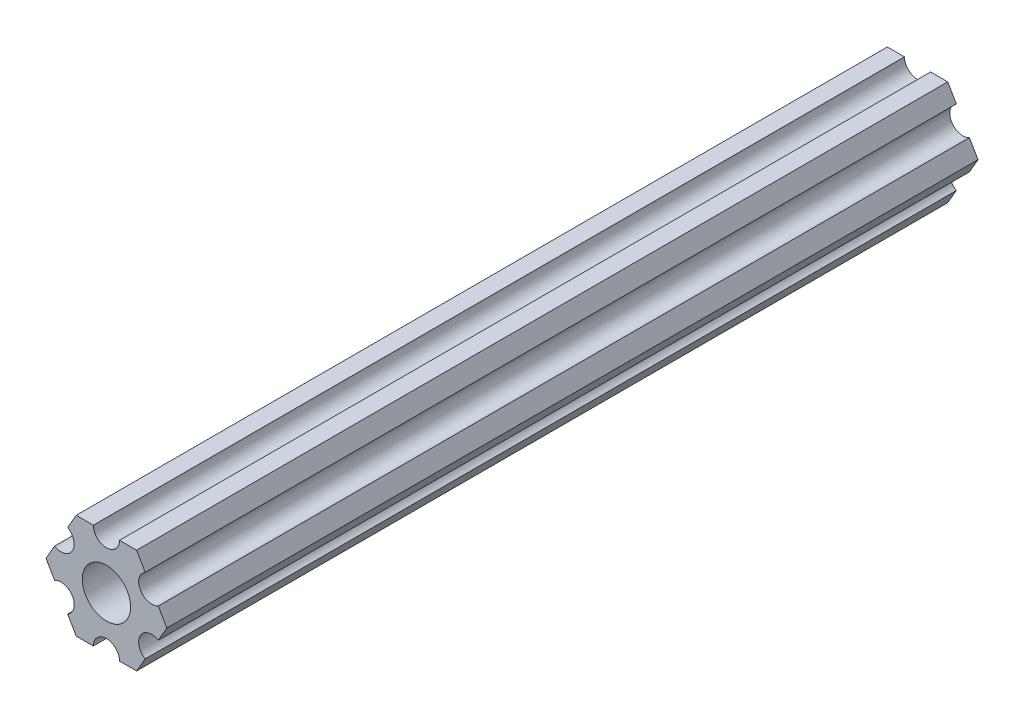
ISO-10303-21;
HEADER;
FILE_DESCRIPTION(('STEP AP214'),'2;1');
FILE_NAME('part.step','',(''),(''),'','','');
FILE_SCHEMA(('AUTOMOTIVE_DESIGN { 1 0 10303 214 1 1 1 1 }'));
ENDSEC;
DATA;
#1=APPLICATION_CONTEXT('core data for automotive mechanical design processes');
#2=APPLICATION_PROTOCOL_DEFINITION('international standard','automotive_design',2000,#1);
#3=PRODUCT_CONTEXT('',#1,'mechanical');
#4=PRODUCT('Part','Part','',(#3));
#5=PRODUCT_RELATED_PRODUCT_CATEGORY('part','',(#4));
#6=PRODUCT_DEFINITION_FORMATION('','',#4);
#7=PRODUCT_DEFINITION_CONTEXT('part definition',#1,'design');
#8=PRODUCT_DEFINITION('design','',#6,#7);
#9=PRODUCT_DEFINITION_SHAPE('','',#8);
#10=(LENGTH_UNIT() NAMED_UNIT(*) SI_UNIT(.MILLI.,.METRE.));
#11=(NAMED_UNIT(*) PLANE_ANGLE_UNIT() SI_UNIT($,.RADIAN.));
#12=(NAMED_UNIT(*) SI_UNIT($,.STERADIAN.) SOLID_ANGLE_UNIT());
#13=UNCERTAINTY_MEASURE_WITH_UNIT(LENGTH_MEASURE(1.E-05),#10,'distance_accuracy_value','');
#14=(GEOMETRIC_REPRESENTATION_CONTEXT(3) GLOBAL_UNCERTAINTY_ASSIGNED_CONTEXT((#13)) GLOBAL_UNIT_ASSIGNED_CONTEXT((#10,
#11,#12)) REPRESENTATION_CONTEXT('',''));
#15=CARTESIAN_POINT('',(0.,0.,0.));
#16=DIRECTION('',(0.,0.,1.));
#17=DIRECTION('',(1.,0.,0.));
#18=AXIS2_PLACEMENT_3D('',#15,#16,#17);
#19=CARTESIAN_POINT('',(6.29301142309098,-1.80018429024546,98.425));
#20=DIRECTION('',(-0.866025434075723,0.499999947533953,0.));
#21=DIRECTION('',(-0.499999947533953,-0.866025434075723,0.));
#22=AXIS2_PLACEMENT_3D('',#19,#20,#21);
#23=PLANE('',#22);
#24=DIRECTION('',(0.,0.,1.));
#25=VECTOR('',#24,1.);
#26=CARTESIAN_POINT('',(7.33234841870826,4.44212519169686E-07,98.425));
#27=LINE('',#26,#25);
#28=CARTESIAN_POINT('',(7.33234841870826,4.44212518961143E-07,0.));
#29=VERTEX_POINT('',#28);
#30=CARTESIAN_POINT('',(7.33234841870826,4.44212519315656E-07,98.425));
#31=VERTEX_POINT('',#30);
#32=EDGE_CURVE('E299',#29,#31,#27,.T.);
#33=ORIENTED_EDGE('',*,*,#32,.T.);
#34=DIRECTION('',(0.499999947533953,0.866025434075723,0.));
#35=VECTOR('',#34,1.);
#36=CARTESIAN_POINT('',(6.29301142309098,-1.80018429024546,98.425));
#37=LINE('',#36,#35);
#38=CARTESIAN_POINT('',(6.29301142309098,-1.80018429024546,98.425));
#39=VERTEX_POINT('',#38);
#40=EDGE_CURVE('E182',#39,#31,#37,.T.);
#41=ORIENTED_EDGE('',*,*,#40,.F.);
#42=DIRECTION('',(0.,0.,-1.));
#43=VECTOR('',#42,1.);
#44=CARTESIAN_POINT('',(6.29301142309098,-1.80018429024546,98.425));
#45=LINE('',#44,#43);
#46=CARTESIAN_POINT('',(6.29301142309098,-1.80018429024546,0.));
#47=VERTEX_POINT('',#46);
#48=EDGE_CURVE('E248',#39,#47,#45,.T.);
#49=ORIENTED_EDGE('',*,*,#48,.T.);
#50=DIRECTION('',(0.499999947533953,0.866025434075723,0.));
#51=VECTOR('',#50,1.);
#52=CARTESIAN_POINT('',(6.29301142309098,-1.80018429024546,0.));
#53=LINE('',#52,#51);
#54=EDGE_CURVE('E186',#47,#29,#53,.T.);
#55=ORIENTED_EDGE('',*,*,#54,.T.);
#56=EDGE_LOOP('',(#33,#41,#49,#55));
#57=FACE_BOUND('',#56,.T.);
#58=ADVANCED_FACE('F17',(#57),#23,.F.);
#59=CARTESIAN_POINT('',(7.33234841870826,4.44212519169686E-07,98.425));
#60=DIRECTION('',(-0.866025373493145,-0.500000052466056,0.));
#61=DIRECTION('',(0.500000052466056,-0.866025373493145,0.));
#62=AXIS2_PLACEMENT_3D('',#59,#60,#61);
#63=PLANE('',#62);
#64=DIRECTION('',(0.,0.,-1.));
#65=VECTOR('',#64,1.);
#66=CARTESIAN_POINT('',(6.29301120497139,1.80018505273895,98.425));
#67=LINE('',#66,#65);
#68=CARTESIAN_POINT('',(6.29301120497139,1.80018505273895,0.));
#69=VERTEX_POINT('',#68);
#70=CARTESIAN_POINT('',(6.29301120497139,1.80018505273895,98.425));
#71=VERTEX_POINT('',#70);
#72=EDGE_CURVE('E297',#69,#71,#67,.F.);
#73=ORIENTED_EDGE('',*,*,#72,.T.);
#74=DIRECTION('',(-0.500000052466056,0.866025373493145,0.));
#75=VECTOR('',#74,1.);
#76=CARTESIAN_POINT('',(7.33234841870826,4.44212519198905E-07,98.425));
#77=LINE('',#76,#75);
#78=EDGE_CURVE('E64',#31,#71,#77,.T.);
#79=ORIENTED_EDGE('',*,*,#78,.F.);
#80=ORIENTED_EDGE('',*,*,#32,.F.);
#81=DIRECTION('',(-0.500000052466056,0.866025373493145,0.));
#82=VECTOR('',#81,1.);
#83=CARTESIAN_POINT('',(7.33234841870826,4.44212519198905E-07,0.));
#84=LINE('',#83,#82);
#85=EDGE_CURVE('E245',#29,#69,#84,.T.);
#86=ORIENTED_EDGE('',*,*,#85,.T.);
#87=EDGE_LOOP('',(#73,#79,#80,#86));
#88=FACE_BOUND('',#87,.T.);
#89=ADVANCED_FACE('F346',(#88),#63,.F.);
#90=CARTESIAN_POINT('',(5.49926112168156,3.17500033315933,98.425));
#91=DIRECTION('',(0.,0.,-1.));
#92=DIRECTION('',(-1.,0.,0.));
#93=AXIS2_PLACEMENT_3D('',#90,#91,#92);
#94=CYLINDRICAL_SURFACE('',#93,1.5875);
#95=CARTESIAN_POINT('',(5.49926112168156,3.17500033315933,98.425));
#96=DIRECTION('',(0.,0.,-1.));
#97=DIRECTION('',(-1.,0.,0.));
#98=AXIS2_PLACEMENT_3D('',#95,#96,#97);
#99=CIRCLE('',#98,1.5875);
#100=CARTESIAN_POINT('',(4.70551103839172,4.54981561357972,98.425));
#101=VERTEX_POINT('',#100);
#102=EDGE_CURVE('E56',#71,#101,#99,.T.);
#103=ORIENTED_EDGE('',*,*,#102,.F.);
#104=ORIENTED_EDGE('',*,*,#72,.F.);
#105=CARTESIAN_POINT('',(5.49926112168156,3.17500033315933,0.));
#106=DIRECTION('',(0.,0.,-1.));
#107=DIRECTION('',(-1.,0.,0.));
#108=AXIS2_PLACEMENT_3D('',#105,#106,#107);
#109=CIRCLE('',#108,1.5875);
#110=CARTESIAN_POINT('',(4.70551103839172,4.54981561357972,0.));
#111=VERTEX_POINT('',#110);
#112=EDGE_CURVE('E20',#69,#111,#109,.T.);
#113=ORIENTED_EDGE('',*,*,#112,.T.);
#114=DIRECTION('',(0.,0.,1.));
#115=VECTOR('',#114,1.);
#116=CARTESIAN_POINT('',(4.70551103839172,4.54981561357972,98.425));
#117=LINE('',#116,#115);
#118=EDGE_CURVE('E293',#111,#101,#117,.T.);
#119=ORIENTED_EDGE('',*,*,#118,.T.);
#120=EDGE_LOOP('',(#103,#104,#113,#119));
#121=FACE_BOUND('',#120,.T.);
#122=ADVANCED_FACE('F344',(#121),#94,.F.);
#123=CARTESIAN_POINT('',(4.70551103839172,4.54981561357972,98.425));
#124=DIRECTION('',(-0.866025373493151,-0.500000052466046,0.));
#125=DIRECTION('',(0.500000052466046,-0.866025373493151,0.));
#126=AXIS2_PLACEMENT_3D('',#123,#124,#125);
#127=PLANE('',#126);
#128=DIRECTION('',(0.,0.,1.));
#129=VECTOR('',#128,1.);
#130=CARTESIAN_POINT('',(3.66617382465481,6.35000022210627,98.425));
#131=LINE('',#130,#129);
#132=CARTESIAN_POINT('',(3.66617382465481,6.35000022210627,0.));
#133=VERTEX_POINT('',#132);
#134=CARTESIAN_POINT('',(3.66617382465481,6.35000022210627,98.425));
#135=VERTEX_POINT('',#134);
#136=EDGE_CURVE('E290',#133,#135,#131,.T.);
#137=ORIENTED_EDGE('',*,*,#136,.T.);
#138=DIRECTION('',(-0.500000052466046,0.866025373493151,0.));
#139=VECTOR('',#138,1.);
#140=CARTESIAN_POINT('',(4.70551103839172,4.54981561357972,98.425));
#141=LINE('',#140,#139);
#142=EDGE_CURVE('E175',#101,#135,#141,.T.);
#143=ORIENTED_EDGE('',*,*,#142,.F.);
#144=ORIENTED_EDGE('',*,*,#118,.F.);
#145=DIRECTION('',(-0.500000052466046,0.866025373493151,0.));
#146=VECTOR('',#145,1.);
#147=CARTESIAN_POINT('',(4.70551103839172,4.54981561357972,0.));
#148=LINE('',#147,#146);
#149=EDGE_CURVE('E238',#111,#133,#148,.T.);
#150=ORIENTED_EDGE('',*,*,#149,.T.);
#151=EDGE_LOOP('',(#137,#143,#144,#150));
#152=FACE_BOUND('',#151,.T.);
#153=ADVANCED_FACE('F337',(#152),#127,.F.);
#154=CARTESIAN_POINT('',(3.66617382465481,6.35000022210627,98.425));
#155=DIRECTION('',(6.05825850611185E-08,-0.999999999999998,0.));
#156=DIRECTION('',(0.999999999999998,6.05825850611185E-08,0.));
#157=AXIS2_PLACEMENT_3D('',#154,#155,#156);
#158=PLANE('',#157);
#159=DIRECTION('',(0.,0.,-1.));
#160=VECTOR('',#159,1.);
#161=CARTESIAN_POINT('',(1.58749961530074,6.35000009617482,98.425));
#162=LINE('',#161,#160);
#163=CARTESIAN_POINT('',(1.58749961530073,6.35000015914054,0.));
#164=VERTEX_POINT('',#163);
#165=CARTESIAN_POINT('',(1.58749961530073,6.35000015914054,98.425));
#166=VERTEX_POINT('',#165);
#167=EDGE_CURVE('E288',#164,#166,#162,.F.);
#168=ORIENTED_EDGE('',*,*,#167,.T.);
#169=DIRECTION('',(1.,0.,0.));
#170=VECTOR('',#169,1.);
#171=CARTESIAN_POINT('',(5.49926112168156,6.35000022210627,98.425));
#172=LINE('',#171,#170);
#173=EDGE_CURVE('E145',#135,#166,#172,.F.);
#174=ORIENTED_EDGE('',*,*,#173,.F.);
#175=ORIENTED_EDGE('',*,*,#136,.F.);
#176=DIRECTION('',(1.,0.,0.));
#177=VECTOR('',#176,1.);
#178=CARTESIAN_POINT('',(5.49926112168156,6.35000022210627,0.));
#179=LINE('',#178,#177);
#180=EDGE_CURVE('E235',#133,#164,#179,.F.);
#181=ORIENTED_EDGE('',*,*,#180,.T.);
#182=EDGE_LOOP('',(#168,#174,#175,#181));
#183=FACE_BOUND('',#182,.T.);
#184=ADVANCED_FACE('F334',(#183),#158,.F.);
#185=CARTESIAN_POINT('',(-3.84699260060323E-07,6.35,98.425));
#186=DIRECTION('',(0.,0.,-1.));
#187=DIRECTION('',(-1.,0.,0.));
#188=AXIS2_PLACEMENT_3D('',#185,#186,#187);
#189=CYLINDRICAL_SURFACE('',#188,1.5875);
#190=DIRECTION('',(0.,0.,1.));
#191=VECTOR('',#190,1.);
#192=CARTESIAN_POINT('',(-1.58750038469926,6.34999990382518,98.425));
#193=LINE('',#192,#191);
#194=CARTESIAN_POINT('',(-1.58750038469926,6.34999990382518,0.));
#195=VERTEX_POINT('',#194);
#196=CARTESIAN_POINT('',(-1.58750038469926,6.34999990382518,98.425));
#197=VERTEX_POINT('',#196);
#198=EDGE_CURVE('E104',#195,#197,#193,.T.);
#199=ORIENTED_EDGE('',*,*,#198,.T.);
#200=CARTESIAN_POINT('',(-3.84699260060323E-07,6.35,98.425));
#201=DIRECTION('',(0.,0.,-1.));
#202=DIRECTION('',(-1.,0.,0.));
#203=AXIS2_PLACEMENT_3D('',#200,#201,#202);
#204=CIRCLE('',#203,1.5875);
#205=EDGE_CURVE('E149',#166,#197,#204,.T.);
#206=ORIENTED_EDGE('',*,*,#205,.F.);
#207=ORIENTED_EDGE('',*,*,#167,.F.);
#208=CARTESIAN_POINT('',(-3.84699260060323E-07,6.35,0.));
#209=DIRECTION('',(0.,0.,-1.));
#210=DIRECTION('',(-1.,0.,0.));
#211=AXIS2_PLACEMENT_3D('',#208,#209,#210);
#212=CIRCLE('',#211,1.5875);
#213=EDGE_CURVE('E232',#164,#195,#212,.T.);
#214=ORIENTED_EDGE('',*,*,#213,.T.);
#215=EDGE_LOOP('',(#199,#206,#207,#214));
#216=FACE_BOUND('',#215,.T.);
#217=ADVANCED_FACE('F328',(#216),#189,.F.);
#218=CARTESIAN_POINT('',(-1.58750038469926,6.34999990382518,98.425));
#219=DIRECTION('',(6.05825963273174E-08,-0.999999999999998,0.));
#220=DIRECTION('',(0.999999999999998,6.05825963273174E-08,0.));
#221=AXIS2_PLACEMENT_3D('',#218,#219,#220);
#222=PLANE('',#221);
#223=DIRECTION('',(0.,0.,1.));
#224=VECTOR('',#223,1.);
#225=CARTESIAN_POINT('',(-3.66617459405349,6.3499997778937,98.425));
#226=LINE('',#225,#224);
#227=CARTESIAN_POINT('',(-3.66617454558244,6.34999986184803,0.));
#228=VERTEX_POINT('',#227);
#229=CARTESIAN_POINT('',(-3.66617454558244,6.34999986184803,98.425));
#230=VERTEX_POINT('',#229);
#231=EDGE_CURVE('E112',#228,#230,#226,.T.);
#232=ORIENTED_EDGE('',*,*,#231,.T.);
#233=DIRECTION('',(1.,0.,0.));
#234=VECTOR('',#233,1.);
#235=CARTESIAN_POINT('',(5.49926112168156,6.34999990382518,98.425));
#236=LINE('',#235,#234);
#237=EDGE_CURVE('E150',#197,#230,#236,.F.);
#238=ORIENTED_EDGE('',*,*,#237,.F.);
#239=ORIENTED_EDGE('',*,*,#198,.F.);
#240=DIRECTION('',(1.,0.,0.));
#241=VECTOR('',#240,1.);
#242=CARTESIAN_POINT('',(5.49926112168156,6.34999990382518,0.));
#243=LINE('',#242,#241);
#244=EDGE_CURVE('E157',#195,#228,#243,.F.);
#245=ORIENTED_EDGE('',*,*,#244,.T.);
#246=EDGE_LOOP('',(#232,#238,#239,#245));
#247=FACE_BOUND('',#246,.T.);
#248=ADVANCED_FACE('F156',(#247),#222,.F.);
#249=CARTESIAN_POINT('',(-3.66617459405349,6.3499997778937,98.425));
#250=DIRECTION('',(0.866025434075729,-0.499999947533942,0.));
#251=DIRECTION('',(0.499999947533942,0.866025434075729,0.));
#252=AXIS2_PLACEMENT_3D('',#249,#250,#251);
#253=PLANE('',#252);
#254=DIRECTION('',(0.,0.,-1.));
#255=VECTOR('',#254,1.);
#256=CARTESIAN_POINT('',(-4.70551158967065,4.54981504343587,98.425));
#257=LINE('',#256,#255);
#258=CARTESIAN_POINT('',(-4.70551158967065,4.54981504343587,0.));
#259=VERTEX_POINT('',#258);
#260=CARTESIAN_POINT('',(-4.70551158967065,4.54981504343587,98.425));
#261=VERTEX_POINT('',#260);
#262=EDGE_CURVE('E158',#259,#261,#257,.F.);
#263=ORIENTED_EDGE('',*,*,#262,.T.);
#264=DIRECTION('',(-0.499999947533943,-0.866025434075729,0.));
#265=VECTOR('',#264,1.);
#266=CARTESIAN_POINT('',(-3.66617459405349,6.3499997778937,98.425));
#267=LINE('',#266,#265);
#268=EDGE_CURVE('E153',#230,#261,#267,.T.);
#269=ORIENTED_EDGE('',*,*,#268,.F.);
#270=ORIENTED_EDGE('',*,*,#231,.F.);
#271=DIRECTION('',(-0.499999947533943,-0.866025434075729,0.));
#272=VECTOR('',#271,1.);
#273=CARTESIAN_POINT('',(-3.66617459405349,6.3499997778937,0.));
#274=LINE('',#273,#272);
#275=EDGE_CURVE('E227',#228,#259,#274,.T.);
#276=ORIENTED_EDGE('',*,*,#275,.T.);
#277=EDGE_LOOP('',(#263,#269,#270,#276));
#278=FACE_BOUND('',#277,.T.);
#279=ADVANCED_FACE('F160',(#278),#253,.F.);
#280=CARTESIAN_POINT('',(-5.49926150638082,3.17499966684067,98.425));
#281=DIRECTION('',(0.,0.,-1.));
#282=DIRECTION('',(-1.,0.,0.));
#283=AXIS2_PLACEMENT_3D('',#280,#281,#282);
#284=CYLINDRICAL_SURFACE('',#283,1.5875);
#285=DIRECTION('',(0.,0.,1.));
#286=VECTOR('',#285,1.);
#287=CARTESIAN_POINT('',(-6.29301142309098,1.80018429024547,98.425));
#288=LINE('',#287,#286);
#289=CARTESIAN_POINT('',(-6.29301142309098,1.80018429024547,0.));
#290=VERTEX_POINT('',#289);
#291=CARTESIAN_POINT('',(-6.29301142309098,1.80018429024547,98.425));
#292=VERTEX_POINT('',#291);
#293=EDGE_CURVE('E279',#290,#292,#288,.T.);
#294=ORIENTED_EDGE('',*,*,#293,.T.);
#295=CARTESIAN_POINT('',(-5.49926150638082,3.17499966684067,98.425));
#296=DIRECTION('',(0.,0.,-1.));
#297=DIRECTION('',(-1.,0.,0.));
#298=AXIS2_PLACEMENT_3D('',#295,#296,#297);
#299=CIRCLE('',#298,1.5875);
#300=EDGE_CURVE('E162',#261,#292,#299,.T.);
#301=ORIENTED_EDGE('',*,*,#300,.F.);
#302=ORIENTED_EDGE('',*,*,#262,.F.);
#303=CARTESIAN_POINT('',(-5.49926150638082,3.17499966684067,0.));
#304=DIRECTION('',(0.,0.,-1.));
#305=DIRECTION('',(-1.,0.,0.));
#306=AXIS2_PLACEMENT_3D('',#303,#304,#305);
#307=CIRCLE('',#306,1.5875);
#308=EDGE_CURVE('E224',#259,#290,#307,.T.);
#309=ORIENTED_EDGE('',*,*,#308,.T.);
#310=EDGE_LOOP('',(#294,#301,#302,#309));
#311=FACE_BOUND('',#310,.T.);
#312=ADVANCED_FACE('F409',(#311),#284,.F.);
#313=CARTESIAN_POINT('',(-6.29301142309098,1.80018429024547,98.425));
#314=DIRECTION('',(0.866025434075724,-0.499999947533951,0.));
#315=DIRECTION('',(0.499999947533951,0.866025434075724,0.));
#316=AXIS2_PLACEMENT_3D('',#313,#314,#315);
#317=PLANE('',#316);
#318=DIRECTION('',(0.,0.,1.));
#319=VECTOR('',#318,1.);
#320=CARTESIAN_POINT('',(-7.33234841870826,-4.44212523790841E-07,98.425));
#321=LINE('',#320,#319);
#322=CARTESIAN_POINT('',(-7.33234841870826,-4.44212524036367E-07,0.));
#323=VERTEX_POINT('',#322);
#324=CARTESIAN_POINT('',(-7.33234841870826,-4.44212524036367E-07,98.425));
#325=VERTEX_POINT('',#324);
#326=EDGE_CURVE('E276',#323,#325,#321,.T.);
#327=ORIENTED_EDGE('',*,*,#326,.T.);
#328=DIRECTION('',(-0.499999947533952,-0.866025434075724,0.));
#329=VECTOR('',#328,1.);
#330=CARTESIAN_POINT('',(-6.29301142309098,1.80018429024547,98.425));
#331=LINE('',#330,#329);
#332=EDGE_CURVE('E164',#292,#325,#331,.T.);
#333=ORIENTED_EDGE('',*,*,#332,.F.);
#334=ORIENTED_EDGE('',*,*,#293,.F.);
#335=DIRECTION('',(-0.499999947533952,-0.866025434075724,0.));
#336=VECTOR('',#335,1.);
#337=CARTESIAN_POINT('',(-6.29301142309098,1.80018429024547,0.));
#338=LINE('',#337,#336);
#339=EDGE_CURVE('E219',#290,#323,#338,.T.);
#340=ORIENTED_EDGE('',*,*,#339,.T.);
#341=EDGE_LOOP('',(#327,#333,#334,#340));
#342=FACE_BOUND('',#341,.T.);
#343=ADVANCED_FACE('F377',(#342),#317,.F.);
#344=CARTESIAN_POINT('',(-7.33234841870826,-4.44212523790841E-07,98.425));
#345=DIRECTION('',(0.866025373493151,0.500000052466045,0.));
#346=DIRECTION('',(-0.500000052466045,0.866025373493151,0.));
#347=AXIS2_PLACEMENT_3D('',#344,#345,#346);
#348=PLANE('',#347);
#349=DIRECTION('',(0.,0.,-1.));
#350=VECTOR('',#349,1.);
#351=CARTESIAN_POINT('',(-6.29301120497141,-1.80018505273896,98.425));
#352=LINE('',#351,#350);
#353=CARTESIAN_POINT('',(-6.29301120497141,-1.80018505273896,0.));
#354=VERTEX_POINT('',#353);
#355=CARTESIAN_POINT('',(-6.29301120497141,-1.80018505273896,98.425));
#356=VERTEX_POINT('',#355);
#357=EDGE_CURVE('E273',#354,#356,#352,.F.);
#358=ORIENTED_EDGE('',*,*,#357,.T.);
#359=DIRECTION('',(0.500000052466045,-0.866025373493151,0.));
#360=VECTOR('',#359,1.);
#361=CARTESIAN_POINT('',(-7.33234841870826,-4.44212523969395E-07,98.425));
#362=LINE('',#361,#360);
#363=EDGE_CURVE('E314',#325,#356,#362,.T.);
#364=ORIENTED_EDGE('',*,*,#363,.F.);
#365=ORIENTED_EDGE('',*,*,#326,.F.);
#366=DIRECTION('',(0.500000052466045,-0.866025373493151,0.));
#367=VECTOR('',#366,1.);
#368=CARTESIAN_POINT('',(-7.33234841870826,-4.44212523969395E-07,0.));
#369=LINE('',#368,#367);
#370=EDGE_CURVE('E216',#323,#354,#369,.T.);
#371=ORIENTED_EDGE('',*,*,#370,.T.);
#372=EDGE_LOOP('',(#358,#364,#365,#371));
#373=FACE_BOUND('',#372,.T.);
#374=ADVANCED_FACE('F381',(#373),#348,.F.);
#375=CARTESIAN_POINT('',(-5.49926112168156,-3.17500033315934,98.425));
#376=DIRECTION('',(0.,0.,-1.));
#377=DIRECTION('',(-1.,0.,0.));
#378=AXIS2_PLACEMENT_3D('',#375,#376,#377);
#379=CYLINDRICAL_SURFACE('',#378,1.5875);
#380=DIRECTION('',(0.,0.,1.));
#381=VECTOR('',#380,1.);
#382=CARTESIAN_POINT('',(-4.70551103839172,-4.54981561357972,98.425));
#383=LINE('',#382,#381);
#384=CARTESIAN_POINT('',(-4.70551103839172,-4.54981561357972,0.));
#385=VERTEX_POINT('',#384);
#386=CARTESIAN_POINT('',(-4.70551103839172,-4.54981561357972,98.425));
#387=VERTEX_POINT('',#386);
#388=EDGE_CURVE('E268',#385,#387,#383,.T.);
#389=ORIENTED_EDGE('',*,*,#388,.T.);
#390=CARTESIAN_POINT('',(-5.49926112168156,-3.17500033315934,98.425));
#391=DIRECTION('',(0.,0.,-1.));
#392=DIRECTION('',(-1.,0.,0.));
#393=AXIS2_PLACEMENT_3D('',#390,#391,#392);
#394=CIRCLE('',#393,1.5875);
#395=EDGE_CURVE('E312',#356,#387,#394,.T.);
#396=ORIENTED_EDGE('',*,*,#395,.F.);
#397=ORIENTED_EDGE('',*,*,#357,.F.);
#398=CARTESIAN_POINT('',(-5.49926112168156,-3.17500033315934,0.));
#399=DIRECTION('',(0.,0.,-1.));
#400=DIRECTION('',(-1.,0.,0.));
#401=AXIS2_PLACEMENT_3D('',#398,#399,#400);
#402=CIRCLE('',#401,1.5875);
#403=EDGE_CURVE('E213',#354,#385,#402,.T.);
#404=ORIENTED_EDGE('',*,*,#403,.T.);
#405=EDGE_LOOP('',(#389,#396,#397,#404));
#406=FACE_BOUND('',#405,.T.);
#407=ADVANCED_FACE('F385',(#406),#379,.F.);
#408=CARTESIAN_POINT('',(-4.70551103839172,-4.54981561357972,98.425));
#409=DIRECTION('',(0.866025373493151,0.500000052466045,0.));
#410=DIRECTION('',(-0.500000052466045,0.866025373493151,0.));
#411=AXIS2_PLACEMENT_3D('',#408,#409,#410);
#412=PLANE('',#411);
#413=DIRECTION('',(0.,0.,1.));
#414=VECTOR('',#413,1.);
#415=CARTESIAN_POINT('',(-3.66617382465481,-6.35000022210628,98.425));
#416=LINE('',#415,#414);
#417=CARTESIAN_POINT('',(-3.6661738246548,-6.35000022210628,0.));
#418=VERTEX_POINT('',#417);
#419=CARTESIAN_POINT('',(-3.6661738246548,-6.35000022210628,98.425));
#420=VERTEX_POINT('',#419);
#421=EDGE_CURVE('E265',#418,#420,#416,.T.);
#422=ORIENTED_EDGE('',*,*,#421,.T.);
#423=DIRECTION('',(0.500000052466045,-0.866025373493151,0.));
#424=VECTOR('',#423,1.);
#425=CARTESIAN_POINT('',(-4.70551103839172,-4.54981561357972,98.425));
#426=LINE('',#425,#424);
#427=EDGE_CURVE('E313',#387,#420,#426,.T.);
#428=ORIENTED_EDGE('',*,*,#427,.F.);
#429=ORIENTED_EDGE('',*,*,#388,.F.);
#430=DIRECTION('',(0.500000052466045,-0.866025373493151,0.));
#431=VECTOR('',#430,1.);
#432=CARTESIAN_POINT('',(-4.70551103839172,-4.54981561357972,0.));
#433=LINE('',#432,#431);
#434=EDGE_CURVE('E208',#385,#418,#433,.T.);
#435=ORIENTED_EDGE('',*,*,#434,.T.);
#436=EDGE_LOOP('',(#422,#428,#429,#435));
#437=FACE_BOUND('',#436,.T.);
#438=ADVANCED_FACE('F391',(#437),#412,.F.);
#439=CARTESIAN_POINT('',(-3.66617382465481,-6.35000022210628,98.425));
#440=DIRECTION('',(-6.05825854783851E-08,0.999999999999998,0.));
#441=DIRECTION('',(-0.999999999999998,-6.05825854783851E-08,0.));
#442=AXIS2_PLACEMENT_3D('',#439,#440,#441);
#443=PLANE('',#442);
#444=DIRECTION('',(0.,0.,-1.));
#445=VECTOR('',#444,1.);
#446=CARTESIAN_POINT('',(-1.58749961530074,-6.35,98.425));
#447=LINE('',#446,#445);
#448=CARTESIAN_POINT('',(-1.58749961530073,-6.35000011105314,0.));
#449=VERTEX_POINT('',#448);
#450=CARTESIAN_POINT('',(-1.58749961530073,-6.35000011105314,98.425));
#451=VERTEX_POINT('',#450);
#452=EDGE_CURVE('E262',#449,#451,#447,.F.);
#453=ORIENTED_EDGE('',*,*,#452,.T.);
#454=DIRECTION('',(1.,0.,0.));
#455=VECTOR('',#454,1.);
#456=CARTESIAN_POINT('',(5.49926112168156,-6.35000022210628,98.425));
#457=LINE('',#456,#455);
#458=EDGE_CURVE('E311',#420,#451,#457,.T.);
#459=ORIENTED_EDGE('',*,*,#458,.F.);
#460=ORIENTED_EDGE('',*,*,#421,.F.);
#461=DIRECTION('',(1.,0.,0.));
#462=VECTOR('',#461,1.);
#463=CARTESIAN_POINT('',(5.49926112168156,-6.35000022210628,0.));
#464=LINE('',#463,#462);
#465=EDGE_CURVE('E205',#418,#449,#464,.T.);
#466=ORIENTED_EDGE('',*,*,#465,.T.);
#467=EDGE_LOOP('',(#453,#459,#460,#466));
#468=FACE_BOUND('',#467,.T.);
#469=ADVANCED_FACE('F395',(#468),#443,.F.);
#470=CARTESIAN_POINT('',(3.8469926204343E-07,-6.35,98.425));
#471=DIRECTION('',(0.,0.,-1.));
#472=DIRECTION('',(-1.,0.,0.));
#473=AXIS2_PLACEMENT_3D('',#470,#471,#472);
#474=CYLINDRICAL_SURFACE('',#473,1.5875);
#475=DIRECTION('',(0.,0.,1.));
#476=VECTOR('',#475,1.);
#477=CARTESIAN_POINT('',(1.58750038469926,-6.34999990382518,98.425));
#478=LINE('',#477,#476);
#479=CARTESIAN_POINT('',(1.58750038469926,-6.34999990382518,0.));
#480=VERTEX_POINT('',#479);
#481=CARTESIAN_POINT('',(1.58750038469926,-6.34999990382518,98.425));
#482=VERTEX_POINT('',#481);
#483=EDGE_CURVE('E257',#480,#482,#478,.T.);
#484=ORIENTED_EDGE('',*,*,#483,.T.);
#485=CARTESIAN_POINT('',(3.8469926204343E-07,-6.35,98.425));
#486=DIRECTION('',(0.,0.,-1.));
#487=DIRECTION('',(-1.,0.,0.));
#488=AXIS2_PLACEMENT_3D('',#485,#486,#487);
#489=CIRCLE('',#488,1.5875);
#490=EDGE_CURVE('E308',#451,#482,#489,.T.);
#491=ORIENTED_EDGE('',*,*,#490,.F.);
#492=ORIENTED_EDGE('',*,*,#452,.F.);
#493=CARTESIAN_POINT('',(3.8469926204343E-07,-6.35,0.));
#494=DIRECTION('',(0.,0.,-1.));
#495=DIRECTION('',(-1.,0.,0.));
#496=AXIS2_PLACEMENT_3D('',#493,#494,#495);
#497=CIRCLE('',#496,1.5875);
#498=EDGE_CURVE('E202',#449,#480,#497,.T.);
#499=ORIENTED_EDGE('',*,*,#498,.T.);
#500=EDGE_LOOP('',(#484,#491,#492,#499));
#501=FACE_BOUND('',#500,.T.);
#502=ADVANCED_FACE('F399',(#501),#474,.F.);
#503=CARTESIAN_POINT('',(1.58750038469926,-6.34999990382518,98.425));
#504=DIRECTION('',(-6.05825721258438E-08,0.999999999999998,0.));
#505=DIRECTION('',(-0.999999999999998,-6.05825721258438E-08,0.));
#506=AXIS2_PLACEMENT_3D('',#503,#504,#505);
#507=PLANE('',#506);
#508=DIRECTION('',(0.,0.,1.));
#509=VECTOR('',#508,1.);
#510=CARTESIAN_POINT('',(3.66617459405346,-6.34999977789375,98.425));
#511=LINE('',#510,#509);
#512=CARTESIAN_POINT('',(3.66617454558244,-6.34999986184804,0.));
#513=VERTEX_POINT('',#512);
#514=CARTESIAN_POINT('',(3.66617454558244,-6.34999986184804,98.425));
#515=VERTEX_POINT('',#514);
#516=EDGE_CURVE('E254',#513,#515,#511,.T.);
#517=ORIENTED_EDGE('',*,*,#516,.T.);
#518=DIRECTION('',(1.,0.,0.));
#519=VECTOR('',#518,1.);
#520=CARTESIAN_POINT('',(5.49926112168156,-6.34999990382518,98.425));
#521=LINE('',#520,#519);
#522=EDGE_CURVE('E310',#482,#515,#521,.T.);
#523=ORIENTED_EDGE('',*,*,#522,.F.);
#524=ORIENTED_EDGE('',*,*,#483,.F.);
#525=DIRECTION('',(1.,0.,0.));
#526=VECTOR('',#525,1.);
#527=CARTESIAN_POINT('',(5.49926112168156,-6.34999990382518,0.));
#528=LINE('',#527,#526);
#529=EDGE_CURVE('E197',#480,#513,#528,.T.);
#530=ORIENTED_EDGE('',*,*,#529,.T.);
#531=EDGE_LOOP('',(#517,#523,#524,#530));
#532=FACE_BOUND('',#531,.T.);
#533=ADVANCED_FACE('F402',(#532),#507,.F.);
#534=CARTESIAN_POINT('',(3.66617459405346,-6.34999977789375,98.425));
#535=DIRECTION('',(-0.86602543407573,0.499999947533941,0.));
#536=DIRECTION('',(-0.499999947533941,-0.86602543407573,0.));
#537=AXIS2_PLACEMENT_3D('',#534,#535,#536);
#538=PLANE('',#537);
#539=DIRECTION('',(0.,0.,1.));
#540=VECTOR('',#539,1.);
#541=CARTESIAN_POINT('',(4.70551158967065,-4.54981504343587,98.425));
#542=LINE('',#541,#540);
#543=CARTESIAN_POINT('',(4.70551158967065,-4.54981504343587,98.425));
#544=VERTEX_POINT('',#543);
#545=CARTESIAN_POINT('',(4.70551158967065,-4.54981504343587,0.));
#546=VERTEX_POINT('',#545);
#547=EDGE_CURVE('E252',#544,#546,#542,.F.);
#548=ORIENTED_EDGE('',*,*,#547,.F.);
#549=DIRECTION('',(0.49999994753394,0.86602543407573,0.));
#550=VECTOR('',#549,1.);
#551=CARTESIAN_POINT('',(3.66617459405346,-6.34999977789376,98.425));
#552=LINE('',#551,#550);
#553=EDGE_CURVE('E307',#515,#544,#552,.T.);
#554=ORIENTED_EDGE('',*,*,#553,.F.);
#555=ORIENTED_EDGE('',*,*,#516,.F.);
#556=DIRECTION('',(0.49999994753394,0.86602543407573,0.));
#557=VECTOR('',#556,1.);
#558=CARTESIAN_POINT('',(3.66617459405346,-6.34999977789376,0.));
#559=LINE('',#558,#557);
#560=EDGE_CURVE('E194',#513,#546,#559,.T.);
#561=ORIENTED_EDGE('',*,*,#560,.T.);
#562=EDGE_LOOP('',(#548,#554,#555,#561));
#563=FACE_BOUND('',#562,.T.);
#564=ADVANCED_FACE('F404',(#563),#538,.F.);
#565=CARTESIAN_POINT('',(5.49926150638082,-3.17499966684067,98.425));
#566=DIRECTION('',(0.,0.,-1.));
#567=DIRECTION('',(-1.,0.,0.));
#568=AXIS2_PLACEMENT_3D('',#565,#566,#567);
#569=CYLINDRICAL_SURFACE('',#568,1.58750000000001);
#570=CARTESIAN_POINT('',(5.49926150638082,-3.17499966684067,98.425));
#571=DIRECTION('',(0.,0.,-1.));
#572=DIRECTION('',(-1.,0.,0.));
#573=AXIS2_PLACEMENT_3D('',#570,#571,#572);
#574=CIRCLE('',#573,1.58750000000001);
#575=EDGE_CURVE('E35',#544,#39,#574,.T.);
#576=ORIENTED_EDGE('',*,*,#575,.F.);
#577=ORIENTED_EDGE('',*,*,#547,.T.);
#578=CARTESIAN_POINT('',(5.49926150638082,-3.17499966684067,0.));
#579=DIRECTION('',(0.,0.,-1.));
#580=DIRECTION('',(-1.,0.,0.));
#581=AXIS2_PLACEMENT_3D('',#578,#579,#580);
#582=CIRCLE('',#581,1.58750000000001);
#583=EDGE_CURVE('E191',#546,#47,#582,.T.);
#584=ORIENTED_EDGE('',*,*,#583,.T.);
#585=ORIENTED_EDGE('',*,*,#48,.F.);
#586=EDGE_LOOP('',(#576,#577,#584,#585));
#587=FACE_BOUND('',#586,.T.);
#588=ADVANCED_FACE('F350',(#587),#569,.F.);
#589=CARTESIAN_POINT('',(5.49926112168156,3.17500033315933,0.));
#590=DIRECTION('',(0.,0.,1.));
#591=DIRECTION('',(1.,0.,0.));
#592=AXIS2_PLACEMENT_3D('',#589,#590,#591);
#593=PLANE('',#592);
#594=CARTESIAN_POINT('',(0.,0.,0.));
#595=DIRECTION('',(0.,0.,-1.));
#596=DIRECTION('',(-1.,0.,0.));
#597=AXIS2_PLACEMENT_3D('',#594,#595,#596);
#598=CIRCLE('',#597,2.9337);
#599=CARTESIAN_POINT('',(-2.9337,0.,0.));
#600=VERTEX_POINT('',#599);
#601=EDGE_CURVE('E26',#600,#600,#598,.F.);
#602=ORIENTED_EDGE('',*,*,#601,.T.);
#603=EDGE_LOOP('',(#602));
#604=FACE_BOUND('',#603,.T.);
#605=ORIENTED_EDGE('',*,*,#583,.F.);
#606=ORIENTED_EDGE('',*,*,#560,.F.);
#607=ORIENTED_EDGE('',*,*,#529,.F.);
#608=ORIENTED_EDGE('',*,*,#498,.F.);
#609=ORIENTED_EDGE('',*,*,#465,.F.);
#610=ORIENTED_EDGE('',*,*,#434,.F.);
#611=ORIENTED_EDGE('',*,*,#403,.F.);
#612=ORIENTED_EDGE('',*,*,#370,.F.);
#613=ORIENTED_EDGE('',*,*,#339,.F.);
#614=ORIENTED_EDGE('',*,*,#308,.F.);
#615=ORIENTED_EDGE('',*,*,#275,.F.);
#616=ORIENTED_EDGE('',*,*,#244,.F.);
#617=ORIENTED_EDGE('',*,*,#213,.F.);
#618=ORIENTED_EDGE('',*,*,#180,.F.);
#619=ORIENTED_EDGE('',*,*,#149,.F.);
#620=ORIENTED_EDGE('',*,*,#112,.F.);
#621=ORIENTED_EDGE('',*,*,#85,.F.);
#622=ORIENTED_EDGE('',*,*,#54,.F.);
#623=EDGE_LOOP('',(#605,#606,#607,#608,#609,#610,#611,#612,#613,#614,#615,#616,#617,#618,#619,
#620,#621,#622));
#624=FACE_BOUND('',#623,.T.);
#625=ADVANCED_FACE('F331',(#604,#624),#593,.F.);
#626=CARTESIAN_POINT('',(5.49926112168156,3.17500033315933,98.425));
#627=DIRECTION('',(0.,0.,1.));
#628=DIRECTION('',(1.,0.,0.));
#629=AXIS2_PLACEMENT_3D('',#626,#627,#628);
#630=PLANE('',#629);
#631=CARTESIAN_POINT('',(0.,0.,98.425));
#632=DIRECTION('',(0.,0.,-1.));
#633=DIRECTION('',(-1.,0.,0.));
#634=AXIS2_PLACEMENT_3D('',#631,#632,#633);
#635=CIRCLE('',#634,2.9337);
#636=CARTESIAN_POINT('',(-2.9337,0.,98.425));
#637=VERTEX_POINT('',#636);
#638=EDGE_CURVE('E11',#637,#637,#635,.T.);
#639=ORIENTED_EDGE('',*,*,#638,.T.);
#640=EDGE_LOOP('',(#639));
#641=FACE_BOUND('',#640,.T.);
#642=ORIENTED_EDGE('',*,*,#553,.T.);
#643=ORIENTED_EDGE('',*,*,#575,.T.);
#644=ORIENTED_EDGE('',*,*,#40,.T.);
#645=ORIENTED_EDGE('',*,*,#78,.T.);
#646=ORIENTED_EDGE('',*,*,#102,.T.);
#647=ORIENTED_EDGE('',*,*,#142,.T.);
#648=ORIENTED_EDGE('',*,*,#173,.T.);
#649=ORIENTED_EDGE('',*,*,#205,.T.);
#650=ORIENTED_EDGE('',*,*,#237,.T.);
#651=ORIENTED_EDGE('',*,*,#268,.T.);
#652=ORIENTED_EDGE('',*,*,#300,.T.);
#653=ORIENTED_EDGE('',*,*,#332,.T.);
#654=ORIENTED_EDGE('',*,*,#363,.T.);
#655=ORIENTED_EDGE('',*,*,#395,.T.);
#656=ORIENTED_EDGE('',*,*,#427,.T.);
#657=ORIENTED_EDGE('',*,*,#458,.T.);
#658=ORIENTED_EDGE('',*,*,#490,.T.);
#659=ORIENTED_EDGE('',*,*,#522,.T.);
#660=EDGE_LOOP('',(#642,#643,#644,#645,#646,#647,#648,#649,#650,#651,#652,#653,#654,#655,#656,
#657,#658,#659));
#661=FACE_BOUND('',#660,.T.);
#662=ADVANCED_FACE('F152',(#641,#661),#630,.T.);
#663=CARTESIAN_POINT('',(0.,0.,98.425));
#664=DIRECTION('',(0.,0.,-1.));
#665=DIRECTION('',(-1.,0.,0.));
#666=AXIS2_PLACEMENT_3D('',#663,#664,#665);
#667=CYLINDRICAL_SURFACE('',#666,2.9337);
#668=ORIENTED_EDGE('',*,*,#601,.F.);
#669=EDGE_LOOP('',(#668));
#670=FACE_BOUND('',#669,.T.);
#671=ORIENTED_EDGE('',*,*,#638,.F.);
#672=EDGE_LOOP('',(#671));
#673=FACE_BOUND('',#672,.T.);
#674=ADVANCED_FACE('F419',(#670,#673),#667,.F.);
#675=CLOSED_SHELL('',(#58,#89,#122,#153,#184,#217,#248,#279,#312,#343,#374,#407,#438,#469,#502,
#533,#564,#588,#625,#662,#674));
#676=MANIFOLD_SOLID_BREP('B1',#675);
#677=ADVANCED_BREP_SHAPE_REPRESENTATION('',(#18,#676),#14);
#678=SHAPE_DEFINITION_REPRESENTATION(#9,#677);
ENDSEC;
END-ISO-10303-21;
